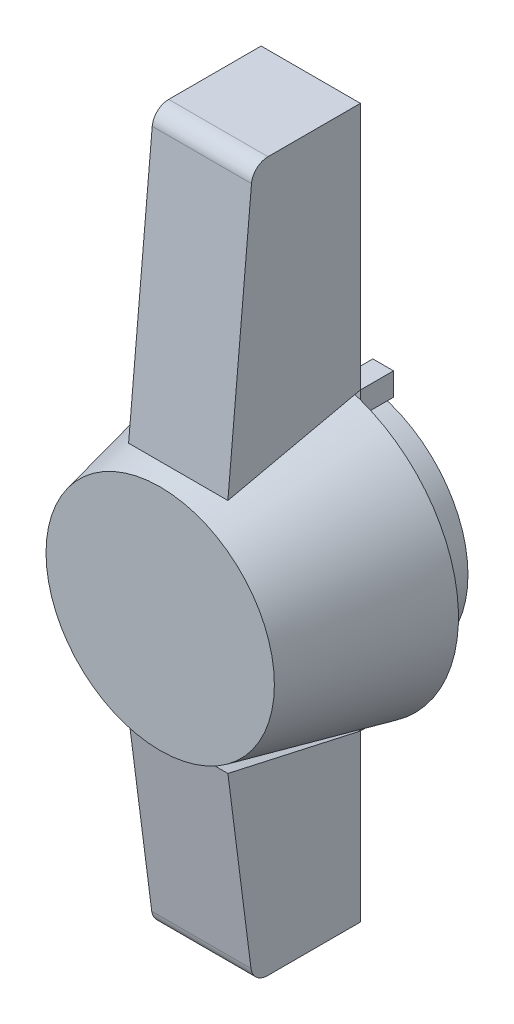
ISO-10303-21;
HEADER;
FILE_DESCRIPTION(('STEP AP214'),'2;1');
FILE_NAME('part.step','',(''),(''),'','','');
FILE_SCHEMA(('AUTOMOTIVE_DESIGN { 1 0 10303 214 1 1 1 1 }'));
ENDSEC;
DATA;
#1=APPLICATION_CONTEXT('core data for automotive mechanical design processes');
#2=APPLICATION_PROTOCOL_DEFINITION('international standard','automotive_design',2000,#1);
#3=PRODUCT_CONTEXT('',#1,'mechanical');
#4=PRODUCT('Part','Part','',(#3));
#5=PRODUCT_RELATED_PRODUCT_CATEGORY('part','',(#4));
#6=PRODUCT_DEFINITION_FORMATION('','',#4);
#7=PRODUCT_DEFINITION_CONTEXT('part definition',#1,'design');
#8=PRODUCT_DEFINITION('design','',#6,#7);
#9=PRODUCT_DEFINITION_SHAPE('','',#8);
#10=(LENGTH_UNIT() NAMED_UNIT(*) SI_UNIT(.MILLI.,.METRE.));
#11=(NAMED_UNIT(*) PLANE_ANGLE_UNIT() SI_UNIT($,.RADIAN.));
#12=(NAMED_UNIT(*) SI_UNIT($,.STERADIAN.) SOLID_ANGLE_UNIT());
#13=UNCERTAINTY_MEASURE_WITH_UNIT(LENGTH_MEASURE(1.E-05),#10,'distance_accuracy_value','');
#14=(GEOMETRIC_REPRESENTATION_CONTEXT(3) GLOBAL_UNCERTAINTY_ASSIGNED_CONTEXT((#13)) GLOBAL_UNIT_ASSIGNED_CONTEXT((#10,
#11,#12)) REPRESENTATION_CONTEXT('',''));
#15=CARTESIAN_POINT('',(0.,0.,0.));
#16=DIRECTION('',(0.,0.,1.));
#17=DIRECTION('',(1.,0.,0.));
#18=AXIS2_PLACEMENT_3D('',#15,#16,#17);
#19=CARTESIAN_POINT('',(6.,-17.85,2.5));
#20=DIRECTION('',(0.,0.,1.));
#21=DIRECTION('',(0.,-1.,0.));
#22=AXIS2_PLACEMENT_3D('',#19,#20,#21);
#23=PLANE('',#22);
#24=DIRECTION('',(0.,1.,0.));
#25=VECTOR('',#24,1.);
#26=CARTESIAN_POINT('',(-6.,-17.85,2.5));
#27=LINE('',#26,#25);
#28=CARTESIAN_POINT('',(-6.,-37.85,2.5));
#29=VERTEX_POINT('',#28);
#30=CARTESIAN_POINT('',(-6.,-17.85,2.5));
#31=VERTEX_POINT('',#30);
#32=EDGE_CURVE('E124',#29,#31,#27,.T.);
#33=ORIENTED_EDGE('',*,*,#32,.T.);
#34=DIRECTION('',(-1.,0.,0.));
#35=VECTOR('',#34,1.);
#36=CARTESIAN_POINT('',(6.,-17.85,2.5));
#37=LINE('',#36,#35);
#38=CARTESIAN_POINT('',(6.,-17.85,2.5));
#39=VERTEX_POINT('',#38);
#40=EDGE_CURVE('E12',#39,#31,#37,.T.);
#41=ORIENTED_EDGE('',*,*,#40,.F.);
#42=DIRECTION('',(0.,1.,0.));
#43=VECTOR('',#42,1.);
#44=CARTESIAN_POINT('',(6.,-17.85,2.5));
#45=LINE('',#44,#43);
#46=CARTESIAN_POINT('',(6.,-37.85,2.5));
#47=VERTEX_POINT('',#46);
#48=EDGE_CURVE('E132',#47,#39,#45,.T.);
#49=ORIENTED_EDGE('',*,*,#48,.F.);
#50=DIRECTION('',(-1.,0.,0.));
#51=VECTOR('',#50,1.);
#52=CARTESIAN_POINT('',(6.,-37.85,2.5));
#53=LINE('',#52,#51);
#54=EDGE_CURVE('E120',#47,#29,#53,.T.);
#55=ORIENTED_EDGE('',*,*,#54,.T.);
#56=EDGE_LOOP('',(#33,#41,#49,#55));
#57=FACE_BOUND('',#56,.T.);
#58=ADVANCED_FACE('F50',(#57),#23,.F.);
#59=CARTESIAN_POINT('',(6.,-17.85,2.5));
#60=DIRECTION('',(0.,-0.976123921027807,0.217214389019924));
#61=DIRECTION('',(0.,-0.217214389019924,-0.976123921027807));
#62=AXIS2_PLACEMENT_3D('',#59,#60,#61);
#63=PLANE('',#62);
#64=DIRECTION('',(0.,0.217214389019924,0.976123921027807));
#65=VECTOR('',#64,1.);
#66=CARTESIAN_POINT('',(-6.,-17.85,2.5));
#67=LINE('',#66,#65);
#68=CARTESIAN_POINT('',(-6.,-14.2851098901099,18.52));
#69=VERTEX_POINT('',#68);
#70=EDGE_CURVE('E127',#31,#69,#67,.T.);
#71=ORIENTED_EDGE('',*,*,#70,.T.);
#72=DIRECTION('',(-1.,0.,0.));
#73=VECTOR('',#72,1.);
#74=CARTESIAN_POINT('',(6.,-14.2851098901099,18.52));
#75=LINE('',#74,#73);
#76=CARTESIAN_POINT('',(6.,-14.2851098901099,18.52));
#77=VERTEX_POINT('',#76);
#78=EDGE_CURVE('E58',#77,#69,#75,.T.);
#79=ORIENTED_EDGE('',*,*,#78,.F.);
#80=DIRECTION('',(0.,0.217214389019924,0.976123921027807));
#81=VECTOR('',#80,1.);
#82=CARTESIAN_POINT('',(6.,-17.85,2.5));
#83=LINE('',#82,#81);
#84=EDGE_CURVE('E100',#39,#77,#83,.T.);
#85=ORIENTED_EDGE('',*,*,#84,.F.);
#86=ORIENTED_EDGE('',*,*,#40,.T.);
#87=EDGE_LOOP('',(#71,#79,#85,#86));
#88=FACE_BOUND('',#87,.T.);
#89=ADVANCED_FACE('F151',(#88),#63,.F.);
#90=CARTESIAN_POINT('',(6.,-14.2851098901099,18.52));
#91=DIRECTION('',(0.,0.127117117216769,-0.9918877146686));
#92=DIRECTION('',(0.,0.9918877146686,0.127117117216769));
#93=AXIS2_PLACEMENT_3D('',#90,#91,#92);
#94=PLANE('',#93);
#95=DIRECTION('',(0.,-0.9918877146686,-0.127117117216769));
#96=VECTOR('',#95,1.);
#97=CARTESIAN_POINT('',(-6.,-14.2851098901099,18.52));
#98=LINE('',#97,#96);
#99=CARTESIAN_POINT('',(-6.,-36.1042342344335,15.723731686735));
#100=VERTEX_POINT('',#99);
#101=EDGE_CURVE('E115',#69,#100,#98,.T.);
#102=ORIENTED_EDGE('',*,*,#101,.T.);
#103=DIRECTION('',(-1.,0.,0.));
#104=VECTOR('',#103,1.);
#105=CARTESIAN_POINT('',(6.,-36.1042342344335,15.723731686735));
#106=LINE('',#105,#104);
#107=CARTESIAN_POINT('',(6.,-36.1042342344335,15.723731686735));
#108=VERTEX_POINT('',#107);
#109=EDGE_CURVE('E112',#108,#100,#106,.T.);
#110=ORIENTED_EDGE('',*,*,#109,.F.);
#111=DIRECTION('',(0.,-0.9918877146686,-0.127117117216769));
#112=VECTOR('',#111,1.);
#113=CARTESIAN_POINT('',(6.,-14.2851098901099,18.52));
#114=LINE('',#113,#112);
#115=EDGE_CURVE('E104',#77,#108,#114,.T.);
#116=ORIENTED_EDGE('',*,*,#115,.F.);
#117=ORIENTED_EDGE('',*,*,#78,.T.);
#118=EDGE_LOOP('',(#102,#110,#116,#117));
#119=FACE_BOUND('',#118,.T.);
#120=ADVANCED_FACE('F113',(#119),#94,.F.);
#121=CARTESIAN_POINT('',(6.,-35.85,13.7399562573978));
#122=DIRECTION('',(-1.,0.,0.));
#123=DIRECTION('',(0.,0.,1.));
#124=AXIS2_PLACEMENT_3D('',#121,#122,#123);
#125=CYLINDRICAL_SURFACE('',#124,2.);
#126=CARTESIAN_POINT('',(-6.,-35.85,13.7399562573978));
#127=DIRECTION('',(1.,0.,0.));
#128=DIRECTION('',(0.,0.,-1.));
#129=AXIS2_PLACEMENT_3D('',#126,#127,#128);
#130=CIRCLE('',#129,2.);
#131=CARTESIAN_POINT('',(-6.,-37.85,13.7399562573978));
#132=VERTEX_POINT('',#131);
#133=EDGE_CURVE('E86',#100,#132,#130,.T.);
#134=ORIENTED_EDGE('',*,*,#133,.T.);
#135=DIRECTION('',(-1.,0.,0.));
#136=VECTOR('',#135,1.);
#137=CARTESIAN_POINT('',(6.,-37.85,13.7399562573978));
#138=LINE('',#137,#136);
#139=CARTESIAN_POINT('',(6.,-37.85,13.7399562573978));
#140=VERTEX_POINT('',#139);
#141=EDGE_CURVE('E116',#140,#132,#138,.T.);
#142=ORIENTED_EDGE('',*,*,#141,.F.);
#143=CARTESIAN_POINT('',(6.,-35.85,13.7399562573978));
#144=DIRECTION('',(1.,0.,0.));
#145=DIRECTION('',(0.,0.,-1.));
#146=AXIS2_PLACEMENT_3D('',#143,#144,#145);
#147=CIRCLE('',#146,2.);
#148=EDGE_CURVE('E108',#108,#140,#147,.T.);
#149=ORIENTED_EDGE('',*,*,#148,.F.);
#150=ORIENTED_EDGE('',*,*,#109,.T.);
#151=EDGE_LOOP('',(#134,#142,#149,#150));
#152=FACE_BOUND('',#151,.T.);
#153=ADVANCED_FACE('F118',(#152),#125,.T.);
#154=CARTESIAN_POINT('',(6.,-37.85,13.7399562573978));
#155=DIRECTION('',(0.,1.,0.));
#156=DIRECTION('',(0.,0.,1.));
#157=AXIS2_PLACEMENT_3D('',#154,#155,#156);
#158=PLANE('',#157);
#159=DIRECTION('',(0.,0.,-1.));
#160=VECTOR('',#159,1.);
#161=CARTESIAN_POINT('',(-6.,-37.85,13.7399562573978));
#162=LINE('',#161,#160);
#163=EDGE_CURVE('E92',#132,#29,#162,.T.);
#164=ORIENTED_EDGE('',*,*,#163,.T.);
#165=ORIENTED_EDGE('',*,*,#54,.F.);
#166=DIRECTION('',(0.,0.,-1.));
#167=VECTOR('',#166,1.);
#168=CARTESIAN_POINT('',(6.,-37.85,13.7399562573978));
#169=LINE('',#168,#167);
#170=EDGE_CURVE('E66',#140,#47,#169,.T.);
#171=ORIENTED_EDGE('',*,*,#170,.F.);
#172=ORIENTED_EDGE('',*,*,#141,.T.);
#173=EDGE_LOOP('',(#164,#165,#171,#172));
#174=FACE_BOUND('',#173,.T.);
#175=ADVANCED_FACE('F140',(#174),#158,.F.);
#176=CARTESIAN_POINT('',(6.,-35.85,13.7399562573978));
#177=DIRECTION('',(1.,0.,0.));
#178=DIRECTION('',(0.,0.,-1.));
#179=AXIS2_PLACEMENT_3D('',#176,#177,#178);
#180=PLANE('',#179);
#181=ORIENTED_EDGE('',*,*,#48,.T.);
#182=ORIENTED_EDGE('',*,*,#84,.T.);
#183=ORIENTED_EDGE('',*,*,#115,.T.);
#184=ORIENTED_EDGE('',*,*,#148,.T.);
#185=ORIENTED_EDGE('',*,*,#170,.T.);
#186=EDGE_LOOP('',(#181,#182,#183,#184,#185));
#187=FACE_BOUND('',#186,.T.);
#188=ADVANCED_FACE('F106',(#187),#180,.T.);
#189=CARTESIAN_POINT('',(-6.,-35.85,13.7399562573978));
#190=DIRECTION('',(1.,0.,0.));
#191=DIRECTION('',(0.,0.,-1.));
#192=AXIS2_PLACEMENT_3D('',#189,#190,#191);
#193=PLANE('',#192);
#194=ORIENTED_EDGE('',*,*,#32,.F.);
#195=ORIENTED_EDGE('',*,*,#163,.F.);
#196=ORIENTED_EDGE('',*,*,#133,.F.);
#197=ORIENTED_EDGE('',*,*,#101,.F.);
#198=ORIENTED_EDGE('',*,*,#70,.F.);
#199=EDGE_LOOP('',(#194,#195,#196,#197,#198));
#200=FACE_BOUND('',#199,.T.);
#201=ADVANCED_FACE('F136',(#200),#193,.F.);
#202=CLOSED_SHELL('',(#58,#89,#120,#153,#175,#188,#201));
#203=MANIFOLD_SOLID_BREP('B2',#202);
#204=CARTESIAN_POINT('',(6.,14.2851098901099,18.52));
#205=DIRECTION('',(0.,0.976123921027807,0.217214389019924));
#206=DIRECTION('',(0.,-0.217214389019924,0.976123921027807));
#207=AXIS2_PLACEMENT_3D('',#204,#205,#206);
#208=PLANE('',#207);
#209=DIRECTION('',(0.,0.217214389019924,-0.976123921027807));
#210=VECTOR('',#209,1.);
#211=CARTESIAN_POINT('',(-6.,14.2851098901099,18.52));
#212=LINE('',#211,#210);
#213=CARTESIAN_POINT('',(-6.,14.2851098901099,18.52));
#214=VERTEX_POINT('',#213);
#215=CARTESIAN_POINT('',(-6.,17.85,2.5));
#216=VERTEX_POINT('',#215);
#217=EDGE_CURVE('E269',#214,#216,#212,.T.);
#218=ORIENTED_EDGE('',*,*,#217,.T.);
#219=DIRECTION('',(-1.,0.,0.));
#220=VECTOR('',#219,1.);
#221=CARTESIAN_POINT('',(6.,17.85,2.5));
#222=LINE('',#221,#220);
#223=CARTESIAN_POINT('',(6.,17.85,2.5));
#224=VERTEX_POINT('',#223);
#225=EDGE_CURVE('E48',#224,#216,#222,.T.);
#226=ORIENTED_EDGE('',*,*,#225,.F.);
#227=DIRECTION('',(0.,0.217214389019924,-0.976123921027807));
#228=VECTOR('',#227,1.);
#229=CARTESIAN_POINT('',(6.,14.2851098901099,18.52));
#230=LINE('',#229,#228);
#231=CARTESIAN_POINT('',(6.,14.2851098901099,18.52));
#232=VERTEX_POINT('',#231);
#233=EDGE_CURVE('E277',#232,#224,#230,.T.);
#234=ORIENTED_EDGE('',*,*,#233,.F.);
#235=DIRECTION('',(-1.,0.,0.));
#236=VECTOR('',#235,1.);
#237=CARTESIAN_POINT('',(6.,14.2851098901099,18.52));
#238=LINE('',#237,#236);
#239=EDGE_CURVE('E265',#232,#214,#238,.T.);
#240=ORIENTED_EDGE('',*,*,#239,.T.);
#241=EDGE_LOOP('',(#218,#226,#234,#240));
#242=FACE_BOUND('',#241,.T.);
#243=ADVANCED_FACE('F195',(#242),#208,.F.);
#244=CARTESIAN_POINT('',(6.,17.85,2.5));
#245=DIRECTION('',(0.,0.,1.));
#246=DIRECTION('',(1.,0.,0.));
#247=AXIS2_PLACEMENT_3D('',#244,#245,#246);
#248=PLANE('',#247);
#249=DIRECTION('',(0.,1.,0.));
#250=VECTOR('',#249,1.);
#251=CARTESIAN_POINT('',(-6.,17.85,2.5));
#252=LINE('',#251,#250);
#253=CARTESIAN_POINT('',(-6.,47.85,2.5));
#254=VERTEX_POINT('',#253);
#255=EDGE_CURVE('E272',#216,#254,#252,.T.);
#256=ORIENTED_EDGE('',*,*,#255,.T.);
#257=DIRECTION('',(-1.,0.,0.));
#258=VECTOR('',#257,1.);
#259=CARTESIAN_POINT('',(6.,47.85,2.5));
#260=LINE('',#259,#258);
#261=CARTESIAN_POINT('',(6.,47.85,2.5));
#262=VERTEX_POINT('',#261);
#263=EDGE_CURVE('E203',#262,#254,#260,.T.);
#264=ORIENTED_EDGE('',*,*,#263,.F.);
#265=DIRECTION('',(0.,1.,0.));
#266=VECTOR('',#265,1.);
#267=CARTESIAN_POINT('',(6.,17.85,2.5));
#268=LINE('',#267,#266);
#269=EDGE_CURVE('E245',#224,#262,#268,.T.);
#270=ORIENTED_EDGE('',*,*,#269,.F.);
#271=ORIENTED_EDGE('',*,*,#225,.T.);
#272=EDGE_LOOP('',(#256,#264,#270,#271));
#273=FACE_BOUND('',#272,.T.);
#274=ADVANCED_FACE('F296',(#273),#248,.F.);
#275=CARTESIAN_POINT('',(6.,47.85,13.671870764096));
#276=DIRECTION('',(0.,-1.,0.));
#277=DIRECTION('',(0.,0.,-1.));
#278=AXIS2_PLACEMENT_3D('',#275,#276,#277);
#279=PLANE('',#278);
#280=DIRECTION('',(0.,0.,1.));
#281=VECTOR('',#280,1.);
#282=CARTESIAN_POINT('',(-6.,47.85,13.671870764096));
#283=LINE('',#282,#281);
#284=CARTESIAN_POINT('',(-6.,47.85,13.671870764096));
#285=VERTEX_POINT('',#284);
#286=EDGE_CURVE('E260',#254,#285,#283,.T.);
#287=ORIENTED_EDGE('',*,*,#286,.T.);
#288=DIRECTION('',(-1.,0.,0.));
#289=VECTOR('',#288,1.);
#290=CARTESIAN_POINT('',(6.,47.85,13.671870764096));
#291=LINE('',#290,#289);
#292=CARTESIAN_POINT('',(6.,47.85,13.671870764096));
#293=VERTEX_POINT('',#292);
#294=EDGE_CURVE('E257',#293,#285,#291,.T.);
#295=ORIENTED_EDGE('',*,*,#294,.F.);
#296=DIRECTION('',(0.,0.,1.));
#297=VECTOR('',#296,1.);
#298=CARTESIAN_POINT('',(6.,47.85,13.671870764096));
#299=LINE('',#298,#297);
#300=EDGE_CURVE('E249',#262,#293,#299,.T.);
#301=ORIENTED_EDGE('',*,*,#300,.F.);
#302=ORIENTED_EDGE('',*,*,#263,.T.);
#303=EDGE_LOOP('',(#287,#295,#301,#302));
#304=FACE_BOUND('',#303,.T.);
#305=ADVANCED_FACE('F258',(#304),#279,.F.);
#306=CARTESIAN_POINT('',(6.,45.85,13.671870764096));
#307=DIRECTION('',(-1.,0.,0.));
#308=DIRECTION('',(0.,0.,1.));
#309=AXIS2_PLACEMENT_3D('',#306,#307,#308);
#310=CYLINDRICAL_SURFACE('',#309,2.);
#311=CARTESIAN_POINT('',(-6.,45.85,13.671870764096));
#312=DIRECTION('',(1.,0.,0.));
#313=DIRECTION('',(0.,0.,-1.));
#314=AXIS2_PLACEMENT_3D('',#311,#312,#313);
#315=CIRCLE('',#314,2.);
#316=CARTESIAN_POINT('',(-6.,46.0292259420911,15.6638240922846));
#317=VERTEX_POINT('',#316);
#318=EDGE_CURVE('E231',#285,#317,#315,.T.);
#319=ORIENTED_EDGE('',*,*,#318,.T.);
#320=DIRECTION('',(-1.,0.,0.));
#321=VECTOR('',#320,1.);
#322=CARTESIAN_POINT('',(6.,46.0292259420911,15.6638240922846));
#323=LINE('',#322,#321);
#324=CARTESIAN_POINT('',(6.,46.0292259420911,15.6638240922846));
#325=VERTEX_POINT('',#324);
#326=EDGE_CURVE('E261',#325,#317,#323,.T.);
#327=ORIENTED_EDGE('',*,*,#326,.F.);
#328=CARTESIAN_POINT('',(6.,45.85,13.671870764096));
#329=DIRECTION('',(1.,0.,0.));
#330=DIRECTION('',(0.,0.,-1.));
#331=AXIS2_PLACEMENT_3D('',#328,#329,#330);
#332=CIRCLE('',#331,2.);
#333=EDGE_CURVE('E253',#293,#325,#332,.T.);
#334=ORIENTED_EDGE('',*,*,#333,.F.);
#335=ORIENTED_EDGE('',*,*,#294,.T.);
#336=EDGE_LOOP('',(#319,#327,#334,#335));
#337=FACE_BOUND('',#336,.T.);
#338=ADVANCED_FACE('F263',(#337),#310,.T.);
#339=CARTESIAN_POINT('',(6.,14.2851098901099,18.52));
#340=DIRECTION('',(0.,-0.0896129710455532,-0.995976664094289));
#341=DIRECTION('',(0.,0.995976664094289,-0.0896129710455532));
#342=AXIS2_PLACEMENT_3D('',#339,#340,#341);
#343=PLANE('',#342);
#344=DIRECTION('',(0.,-0.995976664094289,0.0896129710455532));
#345=VECTOR('',#344,1.);
#346=CARTESIAN_POINT('',(-6.,14.2851098901099,18.52));
#347=LINE('',#346,#345);
#348=EDGE_CURVE('E237',#317,#214,#347,.T.);
#349=ORIENTED_EDGE('',*,*,#348,.T.);
#350=ORIENTED_EDGE('',*,*,#239,.F.);
#351=DIRECTION('',(0.,-0.995976664094289,0.0896129710455532));
#352=VECTOR('',#351,1.);
#353=CARTESIAN_POINT('',(6.,14.2851098901099,18.52));
#354=LINE('',#353,#352);
#355=EDGE_CURVE('E211',#325,#232,#354,.T.);
#356=ORIENTED_EDGE('',*,*,#355,.F.);
#357=ORIENTED_EDGE('',*,*,#326,.T.);
#358=EDGE_LOOP('',(#349,#350,#356,#357));
#359=FACE_BOUND('',#358,.T.);
#360=ADVANCED_FACE('F285',(#359),#343,.F.);
#361=CARTESIAN_POINT('',(6.,45.85,13.671870764096));
#362=DIRECTION('',(1.,0.,0.));
#363=DIRECTION('',(0.,0.,-1.));
#364=AXIS2_PLACEMENT_3D('',#361,#362,#363);
#365=PLANE('',#364);
#366=ORIENTED_EDGE('',*,*,#233,.T.);
#367=ORIENTED_EDGE('',*,*,#269,.T.);
#368=ORIENTED_EDGE('',*,*,#300,.T.);
#369=ORIENTED_EDGE('',*,*,#333,.T.);
#370=ORIENTED_EDGE('',*,*,#355,.T.);
#371=EDGE_LOOP('',(#366,#367,#368,#369,#370));
#372=FACE_BOUND('',#371,.T.);
#373=ADVANCED_FACE('F251',(#372),#365,.T.);
#374=CARTESIAN_POINT('',(-6.,45.85,13.671870764096));
#375=DIRECTION('',(1.,0.,0.));
#376=DIRECTION('',(0.,0.,-1.));
#377=AXIS2_PLACEMENT_3D('',#374,#375,#376);
#378=PLANE('',#377);
#379=ORIENTED_EDGE('',*,*,#217,.F.);
#380=ORIENTED_EDGE('',*,*,#348,.F.);
#381=ORIENTED_EDGE('',*,*,#318,.F.);
#382=ORIENTED_EDGE('',*,*,#286,.F.);
#383=ORIENTED_EDGE('',*,*,#255,.F.);
#384=EDGE_LOOP('',(#379,#380,#381,#382,#383));
#385=FACE_BOUND('',#384,.T.);
#386=ADVANCED_FACE('F281',(#385),#378,.F.);
#387=CLOSED_SHELL('',(#243,#274,#305,#338,#360,#373,#386));
#388=MANIFOLD_SOLID_BREP('B6',#387);
#389=CARTESIAN_POINT('',(0.,0.,2.5));
#390=DIRECTION('',(0.,0.,1.));
#391=DIRECTION('',(1.,0.,0.));
#392=AXIS2_PLACEMENT_3D('',#389,#390,#391);
#393=PLANE('',#392);
#394=CARTESIAN_POINT('',(0.,0.,2.5));
#395=DIRECTION('',(0.,0.,1.));
#396=DIRECTION('',(1.,0.,0.));
#397=AXIS2_PLACEMENT_3D('',#394,#395,#396);
#398=CIRCLE('',#397,14.);
#399=CARTESIAN_POINT('',(14.,0.,2.5));
#400=VERTEX_POINT('',#399);
#401=EDGE_CURVE('E339',#400,#400,#398,.T.);
#402=ORIENTED_EDGE('',*,*,#401,.T.);
#403=EDGE_LOOP('',(#402));
#404=FACE_BOUND('',#403,.T.);
#405=DIRECTION('',(0.,1.,0.));
#406=VECTOR('',#405,1.);
#407=CARTESIAN_POINT('',(3.5,-17.85,2.5));
#408=LINE('',#407,#406);
#409=CARTESIAN_POINT('',(3.5,-17.50349965007,2.5));
#410=VERTEX_POINT('',#409);
#411=CARTESIAN_POINT('',(3.5,-15.084191852202,2.5));
#412=VERTEX_POINT('',#411);
#413=EDGE_CURVE('E748',#410,#412,#408,.T.);
#414=ORIENTED_EDGE('',*,*,#413,.F.);
#415=CARTESIAN_POINT('',(0.,0.,2.5));
#416=DIRECTION('',(0.,0.,-1.));
#417=DIRECTION('',(-1.,0.,0.));
#418=AXIS2_PLACEMENT_3D('',#415,#416,#417);
#419=CIRCLE('',#418,17.85);
#420=CARTESIAN_POINT('',(-3.5,-17.50349965007,2.5));
#421=VERTEX_POINT('',#420);
#422=EDGE_CURVE('E606',#410,#421,#419,.T.);
#423=ORIENTED_EDGE('',*,*,#422,.T.);
#424=DIRECTION('',(0.,-1.,0.));
#425=VECTOR('',#424,1.);
#426=CARTESIAN_POINT('',(-3.5,-17.85,2.5));
#427=LINE('',#426,#425);
#428=CARTESIAN_POINT('',(-3.5,-15.084191852202,2.5));
#429=VERTEX_POINT('',#428);
#430=EDGE_CURVE('E506',#429,#421,#427,.T.);
#431=ORIENTED_EDGE('',*,*,#430,.F.);
#432=DIRECTION('',(1.,0.,0.));
#433=VECTOR('',#432,1.);
#434=CARTESIAN_POINT('',(-6.,-15.084191852202,2.5));
#435=LINE('',#434,#433);
#436=CARTESIAN_POINT('',(-6.,-15.084191852202,2.5));
#437=VERTEX_POINT('',#436);
#438=EDGE_CURVE('E516',#437,#429,#435,.T.);
#439=ORIENTED_EDGE('',*,*,#438,.F.);
#440=DIRECTION('',(0.,1.,0.));
#441=VECTOR('',#440,1.);
#442=CARTESIAN_POINT('',(-6.,-17.85,2.5));
#443=LINE('',#442,#441);
#444=CARTESIAN_POINT('',(-6.,-16.8113800742235,2.5));
#445=VERTEX_POINT('',#444);
#446=EDGE_CURVE('E496',#445,#437,#443,.T.);
#447=ORIENTED_EDGE('',*,*,#446,.F.);
#448=CARTESIAN_POINT('',(-6.,16.8113800742235,2.5));
#449=VERTEX_POINT('',#448);
#450=EDGE_CURVE('E649',#445,#449,#419,.T.);
#451=ORIENTED_EDGE('',*,*,#450,.T.);
#452=DIRECTION('',(0.,1.,0.));
#453=VECTOR('',#452,1.);
#454=CARTESIAN_POINT('',(-6.,17.85,2.5));
#455=LINE('',#454,#453);
#456=CARTESIAN_POINT('',(-6.,15.084191852202,2.5));
#457=VERTEX_POINT('',#456);
#458=EDGE_CURVE('E545',#457,#449,#455,.T.);
#459=ORIENTED_EDGE('',*,*,#458,.F.);
#460=DIRECTION('',(-1.,0.,0.));
#461=VECTOR('',#460,1.);
#462=CARTESIAN_POINT('',(-6.,15.084191852202,2.5));
#463=LINE('',#462,#461);
#464=CARTESIAN_POINT('',(-3.5,15.084191852202,2.5));
#465=VERTEX_POINT('',#464);
#466=EDGE_CURVE('E538',#465,#457,#463,.T.);
#467=ORIENTED_EDGE('',*,*,#466,.F.);
#468=DIRECTION('',(0.,-1.,0.));
#469=VECTOR('',#468,1.);
#470=CARTESIAN_POINT('',(-3.5,17.85,2.5));
#471=LINE('',#470,#469);
#472=CARTESIAN_POINT('',(-3.5,17.50349965007,2.5));
#473=VERTEX_POINT('',#472);
#474=EDGE_CURVE('E550',#473,#465,#471,.T.);
#475=ORIENTED_EDGE('',*,*,#474,.F.);
#476=CARTESIAN_POINT('',(3.5,17.50349965007,2.5));
#477=VERTEX_POINT('',#476);
#478=EDGE_CURVE('E600',#473,#477,#419,.T.);
#479=ORIENTED_EDGE('',*,*,#478,.T.);
#480=DIRECTION('',(0.,1.,0.));
#481=VECTOR('',#480,1.);
#482=CARTESIAN_POINT('',(3.5,17.85,2.5));
#483=LINE('',#482,#481);
#484=CARTESIAN_POINT('',(3.5,15.084191852202,2.5));
#485=VERTEX_POINT('',#484);
#486=EDGE_CURVE('E585',#485,#477,#483,.T.);
#487=ORIENTED_EDGE('',*,*,#486,.F.);
#488=DIRECTION('',(-1.,0.,0.));
#489=VECTOR('',#488,1.);
#490=CARTESIAN_POINT('',(6.,15.084191852202,2.5));
#491=LINE('',#490,#489);
#492=CARTESIAN_POINT('',(6.,15.084191852202,2.5));
#493=VERTEX_POINT('',#492);
#494=EDGE_CURVE('E581',#493,#485,#491,.T.);
#495=ORIENTED_EDGE('',*,*,#494,.F.);
#496=DIRECTION('',(0.,-1.,0.));
#497=VECTOR('',#496,1.);
#498=CARTESIAN_POINT('',(6.,0.,2.5));
#499=LINE('',#498,#497);
#500=CARTESIAN_POINT('',(6.,16.8113800742235,2.5));
#501=VERTEX_POINT('',#500);
#502=EDGE_CURVE('E193',#501,#493,#499,.T.);
#503=ORIENTED_EDGE('',*,*,#502,.F.);
#504=CARTESIAN_POINT('',(6.,-16.8113800742235,2.5));
#505=VERTEX_POINT('',#504);
#506=EDGE_CURVE('E605',#501,#505,#419,.T.);
#507=ORIENTED_EDGE('',*,*,#506,.T.);
#508=DIRECTION('',(0.,-1.,0.));
#509=VECTOR('',#508,1.);
#510=CARTESIAN_POINT('',(6.,-17.85,2.5));
#511=LINE('',#510,#509);
#512=CARTESIAN_POINT('',(6.,-15.084191852202,2.5));
#513=VERTEX_POINT('',#512);
#514=EDGE_CURVE('E351',#513,#505,#511,.T.);
#515=ORIENTED_EDGE('',*,*,#514,.F.);
#516=DIRECTION('',(1.,0.,0.));
#517=VECTOR('',#516,1.);
#518=CARTESIAN_POINT('',(6.,-15.084191852202,2.5));
#519=LINE('',#518,#517);
#520=EDGE_CURVE('E346',#412,#513,#519,.T.);
#521=ORIENTED_EDGE('',*,*,#520,.F.);
#522=EDGE_LOOP('',(#414,#423,#431,#439,#447,#451,#459,#467,#475,#479,#487,#495,#503,#507,#515,#521));
#523=FACE_BOUND('',#522,.T.);
#524=ADVANCED_FACE('F331',(#404,#523),#393,.F.);
#525=CARTESIAN_POINT('',(0.,0.,2.5));
#526=DIRECTION('',(0.,0.,-1.));
#527=DIRECTION('',(-1.,0.,0.));
#528=AXIS2_PLACEMENT_3D('',#525,#526,#527);
#529=CYLINDRICAL_SURFACE('',#528,14.);
#530=ORIENTED_EDGE('',*,*,#401,.F.);
#531=EDGE_LOOP('',(#530));
#532=FACE_BOUND('',#531,.T.);
#533=CARTESIAN_POINT('',(0.,0.,-2.5));
#534=DIRECTION('',(0.,0.,1.));
#535=DIRECTION('',(1.,0.,0.));
#536=AXIS2_PLACEMENT_3D('',#533,#534,#535);
#537=CIRCLE('',#536,14.);
#538=CARTESIAN_POINT('',(14.,0.,-2.5));
#539=VERTEX_POINT('',#538);
#540=EDGE_CURVE('E609',#539,#539,#537,.T.);
#541=ORIENTED_EDGE('',*,*,#540,.T.);
#542=EDGE_LOOP('',(#541));
#543=FACE_BOUND('',#542,.T.);
#544=ADVANCED_FACE('F333',(#532,#543),#529,.T.);
#545=CARTESIAN_POINT('',(0.,0.,-2.5));
#546=DIRECTION('',(0.,0.,1.));
#547=DIRECTION('',(1.,0.,0.));
#548=AXIS2_PLACEMENT_3D('',#545,#546,#547);
#549=PLANE('',#548);
#550=ORIENTED_EDGE('',*,*,#540,.F.);
#551=EDGE_LOOP('',(#550));
#552=FACE_BOUND('',#551,.T.);
#553=ADVANCED_FACE('F615',(#552),#549,.F.);
#554=CARTESIAN_POINT('',(0.,0.,20.7));
#555=DIRECTION('',(0.,0.,-1.));
#556=DIRECTION('',(-1.,0.,0.));
#557=AXIS2_PLACEMENT_3D('',#554,#555,#556);
#558=PLANE('',#557);
#559=CARTESIAN_POINT('',(0.,0.,20.7));
#560=DIRECTION('',(0.,0.,-1.));
#561=DIRECTION('',(-1.,0.,0.));
#562=AXIS2_PLACEMENT_3D('',#559,#560,#561);
#563=CIRCLE('',#562,13.8);
#564=CARTESIAN_POINT('',(-13.8,0.,20.7));
#565=VERTEX_POINT('',#564);
#566=EDGE_CURVE('E604',#565,#565,#563,.T.);
#567=ORIENTED_EDGE('',*,*,#566,.F.);
#568=EDGE_LOOP('',(#567));
#569=FACE_BOUND('',#568,.T.);
#570=ADVANCED_FACE('F617',(#569),#558,.F.);
#571=CARTESIAN_POINT('',(0.,0.,20.7));
#572=DIRECTION('',(0.,0.,-1.));
#573=DIRECTION('',(-1.,0.,0.));
#574=AXIS2_PLACEMENT_3D('',#571,#572,#573);
#575=CONICAL_SURFACE('',#574,13.8,0.218959812648753);
#576=EDGE_CURVE('E645',#421,#445,#419,.T.);
#577=ORIENTED_EDGE('',*,*,#576,.F.);
#578=ORIENTED_EDGE('',*,*,#422,.F.);
#579=EDGE_CURVE('E667',#505,#410,#419,.T.);
#580=ORIENTED_EDGE('',*,*,#579,.F.);
#581=ORIENTED_EDGE('',*,*,#506,.F.);
#582=EDGE_CURVE('E601',#477,#501,#419,.T.);
#583=ORIENTED_EDGE('',*,*,#582,.F.);
#584=ORIENTED_EDGE('',*,*,#478,.F.);
#585=EDGE_CURVE('E666',#449,#473,#419,.T.);
#586=ORIENTED_EDGE('',*,*,#585,.F.);
#587=ORIENTED_EDGE('',*,*,#450,.F.);
#588=EDGE_LOOP('',(#577,#578,#580,#581,#583,#584,#586,#587));
#589=FACE_BOUND('',#588,.T.);
#590=ORIENTED_EDGE('',*,*,#566,.T.);
#591=EDGE_LOOP('',(#590));
#592=FACE_BOUND('',#591,.T.);
#593=ADVANCED_FACE('F622',(#589,#592),#575,.T.);
#594=CARTESIAN_POINT('',(6.,17.85,-1.5));
#595=DIRECTION('',(-1.,0.,0.));
#596=DIRECTION('',(0.,0.,1.));
#597=AXIS2_PLACEMENT_3D('',#594,#595,#596);
#598=PLANE('',#597);
#599=DIRECTION('',(0.,-1.,0.));
#600=VECTOR('',#599,1.);
#601=CARTESIAN_POINT('',(6.,17.85,2.5));
#602=LINE('',#601,#600);
#603=CARTESIAN_POINT('',(6.,17.85,2.5));
#604=VERTEX_POINT('',#603);
#605=EDGE_CURVE('E567',#604,#501,#602,.T.);
#606=ORIENTED_EDGE('',*,*,#605,.T.);
#607=ORIENTED_EDGE('',*,*,#502,.T.);
#608=DIRECTION('',(0.,0.,1.));
#609=VECTOR('',#608,1.);
#610=CARTESIAN_POINT('',(6.,15.084191852202,-1.5));
#611=LINE('',#610,#609);
#612=CARTESIAN_POINT('',(6.,15.084191852202,-1.5));
#613=VERTEX_POINT('',#612);
#614=EDGE_CURVE('E597',#613,#493,#611,.T.);
#615=ORIENTED_EDGE('',*,*,#614,.F.);
#616=DIRECTION('',(0.,-1.,0.));
#617=VECTOR('',#616,1.);
#618=CARTESIAN_POINT('',(6.,17.85,-1.5));
#619=LINE('',#618,#617);
#620=CARTESIAN_POINT('',(6.,17.85,-1.5));
#621=VERTEX_POINT('',#620);
#622=EDGE_CURVE('E568',#621,#613,#619,.T.);
#623=ORIENTED_EDGE('',*,*,#622,.F.);
#624=DIRECTION('',(0.,0.,1.));
#625=VECTOR('',#624,1.);
#626=CARTESIAN_POINT('',(6.,17.85,-1.5));
#627=LINE('',#626,#625);
#628=EDGE_CURVE('E578',#621,#604,#627,.T.);
#629=ORIENTED_EDGE('',*,*,#628,.T.);
#630=EDGE_LOOP('',(#606,#607,#615,#623,#629));
#631=FACE_BOUND('',#630,.T.);
#632=ADVANCED_FACE('F634',(#631),#598,.F.);
#633=CARTESIAN_POINT('',(6.,15.084191852202,-1.5));
#634=DIRECTION('',(0.,1.,0.));
#635=DIRECTION('',(0.,0.,1.));
#636=AXIS2_PLACEMENT_3D('',#633,#634,#635);
#637=PLANE('',#636);
#638=ORIENTED_EDGE('',*,*,#494,.T.);
#639=DIRECTION('',(0.,0.,1.));
#640=VECTOR('',#639,1.);
#641=CARTESIAN_POINT('',(3.5,15.084191852202,-1.5));
#642=LINE('',#641,#640);
#643=CARTESIAN_POINT('',(3.5,15.084191852202,-1.5));
#644=VERTEX_POINT('',#643);
#645=EDGE_CURVE('E594',#644,#485,#642,.T.);
#646=ORIENTED_EDGE('',*,*,#645,.F.);
#647=DIRECTION('',(-1.,0.,0.));
#648=VECTOR('',#647,1.);
#649=CARTESIAN_POINT('',(6.,15.084191852202,-1.5));
#650=LINE('',#649,#648);
#651=EDGE_CURVE('E571',#613,#644,#650,.T.);
#652=ORIENTED_EDGE('',*,*,#651,.F.);
#653=ORIENTED_EDGE('',*,*,#614,.T.);
#654=EDGE_LOOP('',(#638,#646,#652,#653));
#655=FACE_BOUND('',#654,.T.);
#656=ADVANCED_FACE('F640',(#655),#637,.F.);
#657=CARTESIAN_POINT('',(3.5,17.85,-1.5));
#658=DIRECTION('',(1.,0.,0.));
#659=DIRECTION('',(0.,1.,0.));
#660=AXIS2_PLACEMENT_3D('',#657,#658,#659);
#661=PLANE('',#660);
#662=ORIENTED_EDGE('',*,*,#486,.T.);
#663=CARTESIAN_POINT('',(3.5,17.85,2.5));
#664=VERTEX_POINT('',#663);
#665=EDGE_CURVE('E584',#477,#664,#483,.T.);
#666=ORIENTED_EDGE('',*,*,#665,.T.);
#667=DIRECTION('',(0.,0.,1.));
#668=VECTOR('',#667,1.);
#669=CARTESIAN_POINT('',(3.5,17.85,-1.5));
#670=LINE('',#669,#668);
#671=CARTESIAN_POINT('',(3.5,17.85,-1.5));
#672=VERTEX_POINT('',#671);
#673=EDGE_CURVE('E591',#672,#664,#670,.T.);
#674=ORIENTED_EDGE('',*,*,#673,.F.);
#675=DIRECTION('',(0.,1.,0.));
#676=VECTOR('',#675,1.);
#677=CARTESIAN_POINT('',(3.5,17.85,-1.5));
#678=LINE('',#677,#676);
#679=EDGE_CURVE('E574',#644,#672,#678,.T.);
#680=ORIENTED_EDGE('',*,*,#679,.F.);
#681=ORIENTED_EDGE('',*,*,#645,.T.);
#682=EDGE_LOOP('',(#662,#666,#674,#680,#681));
#683=FACE_BOUND('',#682,.T.);
#684=ADVANCED_FACE('F723',(#683),#661,.F.);
#685=CARTESIAN_POINT('',(6.,17.85,-1.5));
#686=DIRECTION('',(0.,-1.,0.));
#687=DIRECTION('',(0.,0.,-1.));
#688=AXIS2_PLACEMENT_3D('',#685,#686,#687);
#689=PLANE('',#688);
#690=DIRECTION('',(1.,0.,0.));
#691=VECTOR('',#690,1.);
#692=CARTESIAN_POINT('',(6.,17.85,2.5));
#693=LINE('',#692,#691);
#694=EDGE_CURVE('E572',#664,#604,#693,.T.);
#695=ORIENTED_EDGE('',*,*,#694,.T.);
#696=ORIENTED_EDGE('',*,*,#628,.F.);
#697=DIRECTION('',(1.,0.,0.));
#698=VECTOR('',#697,1.);
#699=CARTESIAN_POINT('',(6.,17.85,-1.5));
#700=LINE('',#699,#698);
#701=EDGE_CURVE('E576',#672,#621,#700,.T.);
#702=ORIENTED_EDGE('',*,*,#701,.F.);
#703=ORIENTED_EDGE('',*,*,#673,.T.);
#704=EDGE_LOOP('',(#695,#696,#702,#703));
#705=FACE_BOUND('',#704,.T.);
#706=ADVANCED_FACE('F716',(#705),#689,.F.);
#707=CARTESIAN_POINT('',(0.,0.,-1.5));
#708=DIRECTION('',(0.,0.,-1.));
#709=DIRECTION('',(-1.,0.,0.));
#710=AXIS2_PLACEMENT_3D('',#707,#708,#709);
#711=PLANE('',#710);
#712=ORIENTED_EDGE('',*,*,#622,.T.);
#713=ORIENTED_EDGE('',*,*,#651,.T.);
#714=ORIENTED_EDGE('',*,*,#679,.T.);
#715=ORIENTED_EDGE('',*,*,#701,.T.);
#716=EDGE_LOOP('',(#712,#713,#714,#715));
#717=FACE_BOUND('',#716,.T.);
#718=ADVANCED_FACE('F713',(#717),#711,.T.);
#719=CARTESIAN_POINT('',(0.,0.,2.5));
#720=DIRECTION('',(0.,0.,-1.));
#721=DIRECTION('',(-1.,0.,0.));
#722=AXIS2_PLACEMENT_3D('',#719,#720,#721);
#723=PLANE('',#722);
#724=ORIENTED_EDGE('',*,*,#665,.F.);
#725=ORIENTED_EDGE('',*,*,#582,.T.);
#726=ORIENTED_EDGE('',*,*,#605,.F.);
#727=ORIENTED_EDGE('',*,*,#694,.F.);
#728=EDGE_LOOP('',(#724,#725,#726,#727));
#729=FACE_BOUND('',#728,.T.);
#730=ADVANCED_FACE('F712',(#729),#723,.F.);
#731=CARTESIAN_POINT('',(-6.,17.85,-1.5));
#732=DIRECTION('',(1.,0.,0.));
#733=DIRECTION('',(0.,0.,-1.));
#734=AXIS2_PLACEMENT_3D('',#731,#732,#733);
#735=PLANE('',#734);
#736=ORIENTED_EDGE('',*,*,#458,.T.);
#737=CARTESIAN_POINT('',(-6.,17.85,2.5));
#738=VERTEX_POINT('',#737);
#739=EDGE_CURVE('E533',#449,#738,#455,.T.);
#740=ORIENTED_EDGE('',*,*,#739,.T.);
#741=DIRECTION('',(0.,0.,1.));
#742=VECTOR('',#741,1.);
#743=CARTESIAN_POINT('',(-6.,17.85,-1.5));
#744=LINE('',#743,#742);
#745=CARTESIAN_POINT('',(-6.,17.85,-1.5));
#746=VERTEX_POINT('',#745);
#747=EDGE_CURVE('E564',#746,#738,#744,.T.);
#748=ORIENTED_EDGE('',*,*,#747,.F.);
#749=DIRECTION('',(0.,1.,0.));
#750=VECTOR('',#749,1.);
#751=CARTESIAN_POINT('',(-6.,17.85,-1.5));
#752=LINE('',#751,#750);
#753=CARTESIAN_POINT('',(-6.,15.084191852202,-1.5));
#754=VERTEX_POINT('',#753);
#755=EDGE_CURVE('E534',#754,#746,#752,.T.);
#756=ORIENTED_EDGE('',*,*,#755,.F.);
#757=DIRECTION('',(0.,0.,1.));
#758=VECTOR('',#757,1.);
#759=CARTESIAN_POINT('',(-6.,15.084191852202,-1.5));
#760=LINE('',#759,#758);
#761=EDGE_CURVE('E544',#754,#457,#760,.T.);
#762=ORIENTED_EDGE('',*,*,#761,.T.);
#763=EDGE_LOOP('',(#736,#740,#748,#756,#762));
#764=FACE_BOUND('',#763,.T.);
#765=ADVANCED_FACE('F678',(#764),#735,.F.);
#766=CARTESIAN_POINT('',(-6.,17.85,-1.5));
#767=DIRECTION('',(0.,-1.,0.));
#768=DIRECTION('',(0.,0.,-1.));
#769=AXIS2_PLACEMENT_3D('',#766,#767,#768);
#770=PLANE('',#769);
#771=DIRECTION('',(1.,0.,0.));
#772=VECTOR('',#771,1.);
#773=CARTESIAN_POINT('',(-6.,17.85,2.5));
#774=LINE('',#773,#772);
#775=CARTESIAN_POINT('',(-3.5,17.85,2.5));
#776=VERTEX_POINT('',#775);
#777=EDGE_CURVE('E548',#738,#776,#774,.T.);
#778=ORIENTED_EDGE('',*,*,#777,.T.);
#779=DIRECTION('',(0.,0.,1.));
#780=VECTOR('',#779,1.);
#781=CARTESIAN_POINT('',(-3.5,17.85,-1.5));
#782=LINE('',#781,#780);
#783=CARTESIAN_POINT('',(-3.5,17.85,-1.5));
#784=VERTEX_POINT('',#783);
#785=EDGE_CURVE('E561',#784,#776,#782,.T.);
#786=ORIENTED_EDGE('',*,*,#785,.F.);
#787=DIRECTION('',(1.,0.,0.));
#788=VECTOR('',#787,1.);
#789=CARTESIAN_POINT('',(-6.,17.85,-1.5));
#790=LINE('',#789,#788);
#791=EDGE_CURVE('E537',#746,#784,#790,.T.);
#792=ORIENTED_EDGE('',*,*,#791,.F.);
#793=ORIENTED_EDGE('',*,*,#747,.T.);
#794=EDGE_LOOP('',(#778,#786,#792,#793));
#795=FACE_BOUND('',#794,.T.);
#796=ADVANCED_FACE('F691',(#795),#770,.F.);
#797=CARTESIAN_POINT('',(-3.5,17.85,-1.5));
#798=DIRECTION('',(-1.,0.,0.));
#799=DIRECTION('',(0.,-1.,0.));
#800=AXIS2_PLACEMENT_3D('',#797,#798,#799);
#801=PLANE('',#800);
#802=EDGE_CURVE('E551',#776,#473,#471,.T.);
#803=ORIENTED_EDGE('',*,*,#802,.T.);
#804=ORIENTED_EDGE('',*,*,#474,.T.);
#805=DIRECTION('',(0.,0.,1.));
#806=VECTOR('',#805,1.);
#807=CARTESIAN_POINT('',(-3.5,15.084191852202,-1.5));
#808=LINE('',#807,#806);
#809=CARTESIAN_POINT('',(-3.5,15.084191852202,-1.5));
#810=VERTEX_POINT('',#809);
#811=EDGE_CURVE('E558',#810,#465,#808,.T.);
#812=ORIENTED_EDGE('',*,*,#811,.F.);
#813=DIRECTION('',(0.,-1.,0.));
#814=VECTOR('',#813,1.);
#815=CARTESIAN_POINT('',(-3.5,17.85,-1.5));
#816=LINE('',#815,#814);
#817=EDGE_CURVE('E540',#784,#810,#816,.T.);
#818=ORIENTED_EDGE('',*,*,#817,.F.);
#819=ORIENTED_EDGE('',*,*,#785,.T.);
#820=EDGE_LOOP('',(#803,#804,#812,#818,#819));
#821=FACE_BOUND('',#820,.T.);
#822=ADVANCED_FACE('F687',(#821),#801,.F.);
#823=CARTESIAN_POINT('',(-6.,15.084191852202,-1.5));
#824=DIRECTION('',(0.,1.,0.));
#825=DIRECTION('',(0.,0.,1.));
#826=AXIS2_PLACEMENT_3D('',#823,#824,#825);
#827=PLANE('',#826);
#828=ORIENTED_EDGE('',*,*,#466,.T.);
#829=ORIENTED_EDGE('',*,*,#761,.F.);
#830=DIRECTION('',(-1.,0.,0.));
#831=VECTOR('',#830,1.);
#832=CARTESIAN_POINT('',(-6.,15.084191852202,-1.5));
#833=LINE('',#832,#831);
#834=EDGE_CURVE('E542',#810,#754,#833,.T.);
#835=ORIENTED_EDGE('',*,*,#834,.F.);
#836=ORIENTED_EDGE('',*,*,#811,.T.);
#837=EDGE_LOOP('',(#828,#829,#835,#836));
#838=FACE_BOUND('',#837,.T.);
#839=ADVANCED_FACE('F683',(#838),#827,.F.);
#840=CARTESIAN_POINT('',(0.,0.,-1.5));
#841=DIRECTION('',(0.,0.,1.));
#842=DIRECTION('',(1.,0.,0.));
#843=AXIS2_PLACEMENT_3D('',#840,#841,#842);
#844=PLANE('',#843);
#845=ORIENTED_EDGE('',*,*,#755,.T.);
#846=ORIENTED_EDGE('',*,*,#791,.T.);
#847=ORIENTED_EDGE('',*,*,#817,.T.);
#848=ORIENTED_EDGE('',*,*,#834,.T.);
#849=EDGE_LOOP('',(#845,#846,#847,#848));
#850=FACE_BOUND('',#849,.T.);
#851=ADVANCED_FACE('F693',(#850),#844,.F.);
#852=CARTESIAN_POINT('',(0.,0.,2.5));
#853=DIRECTION('',(0.,0.,1.));
#854=DIRECTION('',(1.,0.,0.));
#855=AXIS2_PLACEMENT_3D('',#852,#853,#854);
#856=PLANE('',#855);
#857=ORIENTED_EDGE('',*,*,#585,.T.);
#858=ORIENTED_EDGE('',*,*,#802,.F.);
#859=ORIENTED_EDGE('',*,*,#777,.F.);
#860=ORIENTED_EDGE('',*,*,#739,.F.);
#861=EDGE_LOOP('',(#857,#858,#859,#860));
#862=FACE_BOUND('',#861,.T.);
#863=ADVANCED_FACE('F675',(#862),#856,.T.);
#864=CARTESIAN_POINT('',(-6.,-17.85,-1.5));
#865=DIRECTION('',(0.,1.,0.));
#866=DIRECTION('',(0.,0.,1.));
#867=AXIS2_PLACEMENT_3D('',#864,#865,#866);
#868=PLANE('',#867);
#869=DIRECTION('',(-1.,0.,0.));
#870=VECTOR('',#869,1.);
#871=CARTESIAN_POINT('',(-6.,-17.85,2.5));
#872=LINE('',#871,#870);
#873=CARTESIAN_POINT('',(-3.5,-17.85,2.5));
#874=VERTEX_POINT('',#873);
#875=CARTESIAN_POINT('',(-6.,-17.85,2.5));
#876=VERTEX_POINT('',#875);
#877=EDGE_CURVE('E493',#874,#876,#872,.T.);
#878=ORIENTED_EDGE('',*,*,#877,.T.);
#879=DIRECTION('',(0.,0.,1.));
#880=VECTOR('',#879,1.);
#881=CARTESIAN_POINT('',(-6.,-17.85,-1.5));
#882=LINE('',#881,#880);
#883=CARTESIAN_POINT('',(-6.,-17.85,-1.5));
#884=VERTEX_POINT('',#883);
#885=EDGE_CURVE('E530',#884,#876,#882,.T.);
#886=ORIENTED_EDGE('',*,*,#885,.F.);
#887=DIRECTION('',(-1.,0.,0.));
#888=VECTOR('',#887,1.);
#889=CARTESIAN_POINT('',(-6.,-17.85,-1.5));
#890=LINE('',#889,#888);
#891=CARTESIAN_POINT('',(-3.5,-17.85,-1.5));
#892=VERTEX_POINT('',#891);
#893=EDGE_CURVE('E502',#892,#884,#890,.T.);
#894=ORIENTED_EDGE('',*,*,#893,.F.);
#895=DIRECTION('',(0.,0.,1.));
#896=VECTOR('',#895,1.);
#897=CARTESIAN_POINT('',(-3.5,-17.85,-1.5));
#898=LINE('',#897,#896);
#899=EDGE_CURVE('E511',#892,#874,#898,.T.);
#900=ORIENTED_EDGE('',*,*,#899,.T.);
#901=EDGE_LOOP('',(#878,#886,#894,#900));
#902=FACE_BOUND('',#901,.T.);
#903=ADVANCED_FACE('F700',(#902),#868,.F.);
#904=CARTESIAN_POINT('',(-6.,-17.85,-1.5));
#905=DIRECTION('',(1.,0.,0.));
#906=DIRECTION('',(0.,0.,-1.));
#907=AXIS2_PLACEMENT_3D('',#904,#905,#906);
#908=PLANE('',#907);
#909=EDGE_CURVE('E513',#876,#445,#443,.T.);
#910=ORIENTED_EDGE('',*,*,#909,.T.);
#911=ORIENTED_EDGE('',*,*,#446,.T.);
#912=DIRECTION('',(0.,0.,1.));
#913=VECTOR('',#912,1.);
#914=CARTESIAN_POINT('',(-6.,-15.084191852202,-1.5));
#915=LINE('',#914,#913);
#916=CARTESIAN_POINT('',(-6.,-15.084191852202,-1.5));
#917=VERTEX_POINT('',#916);
#918=EDGE_CURVE('E527',#917,#437,#915,.T.);
#919=ORIENTED_EDGE('',*,*,#918,.F.);
#920=DIRECTION('',(0.,1.,0.));
#921=VECTOR('',#920,1.);
#922=CARTESIAN_POINT('',(-6.,-17.85,-1.5));
#923=LINE('',#922,#921);
#924=EDGE_CURVE('E505',#884,#917,#923,.T.);
#925=ORIENTED_EDGE('',*,*,#924,.F.);
#926=ORIENTED_EDGE('',*,*,#885,.T.);
#927=EDGE_LOOP('',(#910,#911,#919,#925,#926));
#928=FACE_BOUND('',#927,.T.);
#929=ADVANCED_FACE('F665',(#928),#908,.F.);
#930=CARTESIAN_POINT('',(-6.,-15.084191852202,-1.5));
#931=DIRECTION('',(0.,-1.,0.));
#932=DIRECTION('',(0.,0.,-1.));
#933=AXIS2_PLACEMENT_3D('',#930,#931,#932);
#934=PLANE('',#933);
#935=ORIENTED_EDGE('',*,*,#438,.T.);
#936=DIRECTION('',(0.,0.,1.));
#937=VECTOR('',#936,1.);
#938=CARTESIAN_POINT('',(-3.5,-15.084191852202,-1.5));
#939=LINE('',#938,#937);
#940=CARTESIAN_POINT('',(-3.5,-15.084191852202,-1.5));
#941=VERTEX_POINT('',#940);
#942=EDGE_CURVE('E524',#941,#429,#939,.T.);
#943=ORIENTED_EDGE('',*,*,#942,.F.);
#944=DIRECTION('',(1.,0.,0.));
#945=VECTOR('',#944,1.);
#946=CARTESIAN_POINT('',(-6.,-15.084191852202,-1.5));
#947=LINE('',#946,#945);
#948=EDGE_CURVE('E508',#917,#941,#947,.T.);
#949=ORIENTED_EDGE('',*,*,#948,.F.);
#950=ORIENTED_EDGE('',*,*,#918,.T.);
#951=EDGE_LOOP('',(#935,#943,#949,#950));
#952=FACE_BOUND('',#951,.T.);
#953=ADVANCED_FACE('F661',(#952),#934,.F.);
#954=CARTESIAN_POINT('',(-3.5,-17.85,-1.5));
#955=DIRECTION('',(-1.,0.,0.));
#956=DIRECTION('',(0.,-1.,0.));
#957=AXIS2_PLACEMENT_3D('',#954,#955,#956);
#958=PLANE('',#957);
#959=ORIENTED_EDGE('',*,*,#430,.T.);
#960=EDGE_CURVE('E519',#421,#874,#427,.T.);
#961=ORIENTED_EDGE('',*,*,#960,.T.);
#962=ORIENTED_EDGE('',*,*,#899,.F.);
#963=DIRECTION('',(0.,-1.,0.));
#964=VECTOR('',#963,1.);
#965=CARTESIAN_POINT('',(-3.5,-17.85,-1.5));
#966=LINE('',#965,#964);
#967=EDGE_CURVE('E510',#941,#892,#966,.T.);
#968=ORIENTED_EDGE('',*,*,#967,.F.);
#969=ORIENTED_EDGE('',*,*,#942,.T.);
#970=EDGE_LOOP('',(#959,#961,#962,#968,#969));
#971=FACE_BOUND('',#970,.T.);
#972=ADVANCED_FACE('F656',(#971),#958,.F.);
#973=CARTESIAN_POINT('',(0.,0.,-1.5));
#974=DIRECTION('',(0.,0.,1.));
#975=DIRECTION('',(1.,0.,0.));
#976=AXIS2_PLACEMENT_3D('',#973,#974,#975);
#977=PLANE('',#976);
#978=ORIENTED_EDGE('',*,*,#893,.T.);
#979=ORIENTED_EDGE('',*,*,#924,.T.);
#980=ORIENTED_EDGE('',*,*,#948,.T.);
#981=ORIENTED_EDGE('',*,*,#967,.T.);
#982=EDGE_LOOP('',(#978,#979,#980,#981));
#983=FACE_BOUND('',#982,.T.);
#984=ADVANCED_FACE('F775',(#983),#977,.F.);
#985=CARTESIAN_POINT('',(0.,0.,2.5));
#986=DIRECTION('',(0.,0.,1.));
#987=DIRECTION('',(1.,0.,0.));
#988=AXIS2_PLACEMENT_3D('',#985,#986,#987);
#989=PLANE('',#988);
#990=ORIENTED_EDGE('',*,*,#576,.T.);
#991=ORIENTED_EDGE('',*,*,#909,.F.);
#992=ORIENTED_EDGE('',*,*,#877,.F.);
#993=ORIENTED_EDGE('',*,*,#960,.F.);
#994=EDGE_LOOP('',(#990,#991,#992,#993));
#995=FACE_BOUND('',#994,.T.);
#996=ADVANCED_FACE('F653',(#995),#989,.T.);
#997=CARTESIAN_POINT('',(6.,-17.85,-1.5));
#998=DIRECTION('',(0.,1.,0.));
#999=DIRECTION('',(0.,0.,1.));
#1000=AXIS2_PLACEMENT_3D('',#997,#998,#999);
#1001=PLANE('',#1000);
#1002=DIRECTION('',(-1.,0.,0.));
#1003=VECTOR('',#1002,1.);
#1004=CARTESIAN_POINT('',(6.,-17.85,2.5));
#1005=LINE('',#1004,#1003);
#1006=CARTESIAN_POINT('',(6.,-17.85,2.5));
#1007=VERTEX_POINT('',#1006);
#1008=CARTESIAN_POINT('',(3.5,-17.85,2.5));
#1009=VERTEX_POINT('',#1008);
#1010=EDGE_CURVE('E492',#1007,#1009,#1005,.T.);
#1011=ORIENTED_EDGE('',*,*,#1010,.T.);
#1012=DIRECTION('',(0.,0.,1.));
#1013=VECTOR('',#1012,1.);
#1014=CARTESIAN_POINT('',(3.5,-17.85,-1.5));
#1015=LINE('',#1014,#1013);
#1016=CARTESIAN_POINT('',(3.5,-17.85,-1.5));
#1017=VERTEX_POINT('',#1016);
#1018=EDGE_CURVE('E473',#1017,#1009,#1015,.T.);
#1019=ORIENTED_EDGE('',*,*,#1018,.F.);
#1020=DIRECTION('',(-1.,0.,0.));
#1021=VECTOR('',#1020,1.);
#1022=CARTESIAN_POINT('',(6.,-17.85,-1.5));
#1023=LINE('',#1022,#1021);
#1024=CARTESIAN_POINT('',(6.,-17.85,-1.5));
#1025=VERTEX_POINT('',#1024);
#1026=EDGE_CURVE('E480',#1025,#1017,#1023,.T.);
#1027=ORIENTED_EDGE('',*,*,#1026,.F.);
#1028=DIRECTION('',(0.,0.,1.));
#1029=VECTOR('',#1028,1.);
#1030=CARTESIAN_POINT('',(6.,-17.85,-1.5));
#1031=LINE('',#1030,#1029);
#1032=EDGE_CURVE('E755',#1025,#1007,#1031,.T.);
#1033=ORIENTED_EDGE('',*,*,#1032,.T.);
#1034=EDGE_LOOP('',(#1011,#1019,#1027,#1033));
#1035=FACE_BOUND('',#1034,.T.);
#1036=ADVANCED_FACE('F490',(#1035),#1001,.F.);
#1037=CARTESIAN_POINT('',(3.5,-17.85,-1.5));
#1038=DIRECTION('',(1.,0.,0.));
#1039=DIRECTION('',(0.,1.,0.));
#1040=AXIS2_PLACEMENT_3D('',#1037,#1038,#1039);
#1041=PLANE('',#1040);
#1042=EDGE_CURVE('E746',#1009,#410,#408,.T.);
#1043=ORIENTED_EDGE('',*,*,#1042,.T.);
#1044=ORIENTED_EDGE('',*,*,#413,.T.);
#1045=DIRECTION('',(0.,0.,1.));
#1046=VECTOR('',#1045,1.);
#1047=CARTESIAN_POINT('',(3.5,-15.084191852202,-1.5));
#1048=LINE('',#1047,#1046);
#1049=CARTESIAN_POINT('',(3.5,-15.084191852202,-1.5));
#1050=VERTEX_POINT('',#1049);
#1051=EDGE_CURVE('E476',#1050,#412,#1048,.T.);
#1052=ORIENTED_EDGE('',*,*,#1051,.F.);
#1053=DIRECTION('',(0.,1.,0.));
#1054=VECTOR('',#1053,1.);
#1055=CARTESIAN_POINT('',(3.5,-17.85,-1.5));
#1056=LINE('',#1055,#1054);
#1057=EDGE_CURVE('E468',#1017,#1050,#1056,.T.);
#1058=ORIENTED_EDGE('',*,*,#1057,.F.);
#1059=ORIENTED_EDGE('',*,*,#1018,.T.);
#1060=EDGE_LOOP('',(#1043,#1044,#1052,#1058,#1059));
#1061=FACE_BOUND('',#1060,.T.);
#1062=ADVANCED_FACE('F471',(#1061),#1041,.F.);
#1063=CARTESIAN_POINT('',(6.,-15.084191852202,-1.5));
#1064=DIRECTION('',(0.,-1.,0.));
#1065=DIRECTION('',(0.,0.,-1.));
#1066=AXIS2_PLACEMENT_3D('',#1063,#1064,#1065);
#1067=PLANE('',#1066);
#1068=ORIENTED_EDGE('',*,*,#520,.T.);
#1069=DIRECTION('',(0.,0.,1.));
#1070=VECTOR('',#1069,1.);
#1071=CARTESIAN_POINT('',(6.,-15.084191852202,-1.5));
#1072=LINE('',#1071,#1070);
#1073=CARTESIAN_POINT('',(6.,-15.084191852202,-1.5));
#1074=VERTEX_POINT('',#1073);
#1075=EDGE_CURVE('E498',#1074,#513,#1072,.T.);
#1076=ORIENTED_EDGE('',*,*,#1075,.F.);
#1077=DIRECTION('',(1.,0.,0.));
#1078=VECTOR('',#1077,1.);
#1079=CARTESIAN_POINT('',(6.,-15.084191852202,-1.5));
#1080=LINE('',#1079,#1078);
#1081=EDGE_CURVE('E479',#1050,#1074,#1080,.T.);
#1082=ORIENTED_EDGE('',*,*,#1081,.F.);
#1083=ORIENTED_EDGE('',*,*,#1051,.T.);
#1084=EDGE_LOOP('',(#1068,#1076,#1082,#1083));
#1085=FACE_BOUND('',#1084,.T.);
#1086=ADVANCED_FACE('F761',(#1085),#1067,.F.);
#1087=CARTESIAN_POINT('',(6.,-17.85,-1.5));
#1088=DIRECTION('',(-1.,0.,0.));
#1089=DIRECTION('',(0.,0.,1.));
#1090=AXIS2_PLACEMENT_3D('',#1087,#1088,#1089);
#1091=PLANE('',#1090);
#1092=ORIENTED_EDGE('',*,*,#514,.T.);
#1093=EDGE_CURVE('E747',#505,#1007,#511,.T.);
#1094=ORIENTED_EDGE('',*,*,#1093,.T.);
#1095=ORIENTED_EDGE('',*,*,#1032,.F.);
#1096=DIRECTION('',(0.,-1.,0.));
#1097=VECTOR('',#1096,1.);
#1098=CARTESIAN_POINT('',(6.,-17.85,-1.5));
#1099=LINE('',#1098,#1097);
#1100=EDGE_CURVE('E485',#1074,#1025,#1099,.T.);
#1101=ORIENTED_EDGE('',*,*,#1100,.F.);
#1102=ORIENTED_EDGE('',*,*,#1075,.T.);
#1103=EDGE_LOOP('',(#1092,#1094,#1095,#1101,#1102));
#1104=FACE_BOUND('',#1103,.T.);
#1105=ADVANCED_FACE('F759',(#1104),#1091,.F.);
#1106=CARTESIAN_POINT('',(0.,0.,-1.5));
#1107=DIRECTION('',(0.,0.,-1.));
#1108=DIRECTION('',(-1.,0.,0.));
#1109=AXIS2_PLACEMENT_3D('',#1106,#1107,#1108);
#1110=PLANE('',#1109);
#1111=ORIENTED_EDGE('',*,*,#1026,.T.);
#1112=ORIENTED_EDGE('',*,*,#1057,.T.);
#1113=ORIENTED_EDGE('',*,*,#1081,.T.);
#1114=ORIENTED_EDGE('',*,*,#1100,.T.);
#1115=EDGE_LOOP('',(#1111,#1112,#1113,#1114));
#1116=FACE_BOUND('',#1115,.T.);
#1117=ADVANCED_FACE('F483',(#1116),#1110,.T.);
#1118=CARTESIAN_POINT('',(0.,0.,2.5));
#1119=DIRECTION('',(0.,0.,-1.));
#1120=DIRECTION('',(-1.,0.,0.));
#1121=AXIS2_PLACEMENT_3D('',#1118,#1119,#1120);
#1122=PLANE('',#1121);
#1123=ORIENTED_EDGE('',*,*,#1093,.F.);
#1124=ORIENTED_EDGE('',*,*,#579,.T.);
#1125=ORIENTED_EDGE('',*,*,#1042,.F.);
#1126=ORIENTED_EDGE('',*,*,#1010,.F.);
#1127=EDGE_LOOP('',(#1123,#1124,#1125,#1126));
#1128=FACE_BOUND('',#1127,.T.);
#1129=ADVANCED_FACE('F745',(#1128),#1122,.F.);
#1130=CLOSED_SHELL('',(#524,#544,#553,#570,#593,#632,#656,#684,#706,#718,#730,#765,#796,#822,
#839,#851,#863,#903,#929,#953,#972,#984,#996,#1036,#1062,#1086,#1105,#1117,#1129));
#1131=MANIFOLD_SOLID_BREP('B42',#1130);
#1132=ADVANCED_BREP_SHAPE_REPRESENTATION('',(#18,#203,#388,#1131),#14);
#1133=SHAPE_DEFINITION_REPRESENTATION(#9,#1132);
ENDSEC;
END-ISO-10303-21;
